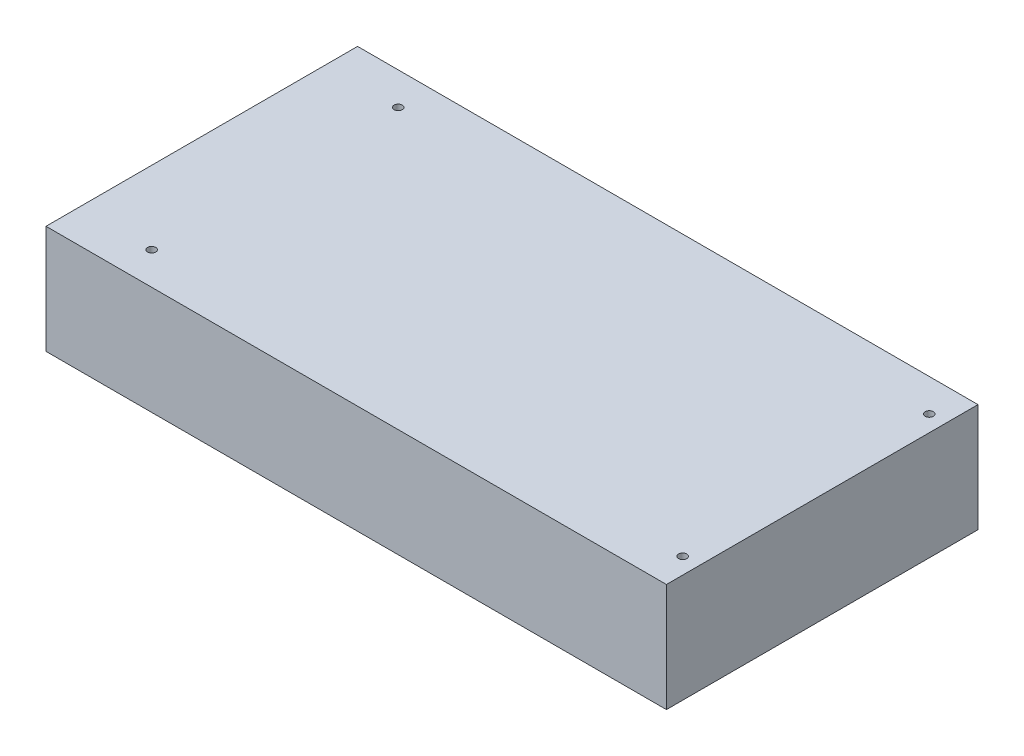
ISO-10303-21;
HEADER;
FILE_DESCRIPTION(('STEP AP214'),'2;1');
FILE_NAME('part.step','',(''),(''),'','','');
FILE_SCHEMA(('AUTOMOTIVE_DESIGN { 1 0 10303 214 1 1 1 1 }'));
ENDSEC;
DATA;
#1=APPLICATION_CONTEXT('core data for automotive mechanical design processes');
#2=APPLICATION_PROTOCOL_DEFINITION('international standard','automotive_design',2000,#1);
#3=PRODUCT_CONTEXT('',#1,'mechanical');
#4=PRODUCT('Part','Part','',(#3));
#5=PRODUCT_RELATED_PRODUCT_CATEGORY('part','',(#4));
#6=PRODUCT_DEFINITION_FORMATION('','',#4);
#7=PRODUCT_DEFINITION_CONTEXT('part definition',#1,'design');
#8=PRODUCT_DEFINITION('design','',#6,#7);
#9=PRODUCT_DEFINITION_SHAPE('','',#8);
#10=(LENGTH_UNIT() NAMED_UNIT(*) SI_UNIT(.MILLI.,.METRE.));
#11=(NAMED_UNIT(*) PLANE_ANGLE_UNIT() SI_UNIT($,.RADIAN.));
#12=(NAMED_UNIT(*) SI_UNIT($,.STERADIAN.) SOLID_ANGLE_UNIT());
#13=UNCERTAINTY_MEASURE_WITH_UNIT(LENGTH_MEASURE(1.E-05),#10,'distance_accuracy_value','');
#14=(GEOMETRIC_REPRESENTATION_CONTEXT(3) GLOBAL_UNCERTAINTY_ASSIGNED_CONTEXT((#13)) GLOBAL_UNIT_ASSIGNED_CONTEXT((#10,
#11,#12)) REPRESENTATION_CONTEXT('',''));
#15=CARTESIAN_POINT('',(0.,0.,0.));
#16=DIRECTION('',(0.,0.,1.));
#17=DIRECTION('',(1.,0.,0.));
#18=AXIS2_PLACEMENT_3D('',#15,#16,#17);
#19=CARTESIAN_POINT('',(227.789756229659,40.,0.));
#20=DIRECTION('',(1.,0.,0.));
#21=DIRECTION('',(0.,0.,-1.));
#22=AXIS2_PLACEMENT_3D('',#19,#20,#21);
#23=PLANE('',#22);
#24=DIRECTION('',(0.,0.,1.));
#25=VECTOR('',#24,1.);
#26=CARTESIAN_POINT('',(227.789756229659,0.,0.));
#27=LINE('',#26,#25);
#28=CARTESIAN_POINT('',(227.789756229659,0.,-35.3016412504768));
#29=VERTEX_POINT('',#28);
#30=CARTESIAN_POINT('',(227.789756229659,0.,79.6983587495232));
#31=VERTEX_POINT('',#30);
#32=EDGE_CURVE('E131',#29,#31,#27,.T.);
#33=ORIENTED_EDGE('',*,*,#32,.F.);
#34=DIRECTION('',(0.,-1.,0.));
#35=VECTOR('',#34,1.);
#36=CARTESIAN_POINT('',(227.789756229659,40.,-35.3016412504768));
#37=LINE('',#36,#35);
#38=CARTESIAN_POINT('',(227.789756229659,40.,-35.3016412504768));
#39=VERTEX_POINT('',#38);
#40=EDGE_CURVE('E11',#39,#29,#37,.T.);
#41=ORIENTED_EDGE('',*,*,#40,.F.);
#42=DIRECTION('',(0.,0.,1.));
#43=VECTOR('',#42,1.);
#44=CARTESIAN_POINT('',(227.789756229659,40.,0.));
#45=LINE('',#44,#43);
#46=CARTESIAN_POINT('',(227.789756229659,40.,79.6983587495232));
#47=VERTEX_POINT('',#46);
#48=EDGE_CURVE('E105',#39,#47,#45,.T.);
#49=ORIENTED_EDGE('',*,*,#48,.T.);
#50=DIRECTION('',(0.,-1.,0.));
#51=VECTOR('',#50,1.);
#52=CARTESIAN_POINT('',(227.789756229659,40.,79.6983587495232));
#53=LINE('',#52,#51);
#54=EDGE_CURVE('E82',#47,#31,#53,.T.);
#55=ORIENTED_EDGE('',*,*,#54,.T.);
#56=EDGE_LOOP('',(#33,#41,#49,#55));
#57=FACE_BOUND('',#56,.T.);
#58=ADVANCED_FACE('F41',(#57),#23,.T.);
#59=CARTESIAN_POINT('',(0.,40.,-35.3016412504768));
#60=DIRECTION('',(0.,0.,-1.));
#61=DIRECTION('',(-1.,0.,0.));
#62=AXIS2_PLACEMENT_3D('',#59,#60,#61);
#63=PLANE('',#62);
#64=DIRECTION('',(1.,0.,0.));
#65=VECTOR('',#64,1.);
#66=CARTESIAN_POINT('',(0.,0.,-35.3016412504768));
#67=LINE('',#66,#65);
#68=CARTESIAN_POINT('',(-1.21024377034129,0.,-35.3016412504768));
#69=VERTEX_POINT('',#68);
#70=EDGE_CURVE('E94',#69,#29,#67,.T.);
#71=ORIENTED_EDGE('',*,*,#70,.F.);
#72=DIRECTION('',(0.,-1.,0.));
#73=VECTOR('',#72,1.);
#74=CARTESIAN_POINT('',(-1.21024377034129,40.,-35.3016412504768));
#75=LINE('',#74,#73);
#76=CARTESIAN_POINT('',(-1.21024377034129,40.,-35.3016412504768));
#77=VERTEX_POINT('',#76);
#78=EDGE_CURVE('E51',#77,#69,#75,.T.);
#79=ORIENTED_EDGE('',*,*,#78,.F.);
#80=DIRECTION('',(1.,0.,0.));
#81=VECTOR('',#80,1.);
#82=CARTESIAN_POINT('',(0.,40.,-35.3016412504768));
#83=LINE('',#82,#81);
#84=EDGE_CURVE('E92',#77,#39,#83,.T.);
#85=ORIENTED_EDGE('',*,*,#84,.T.);
#86=ORIENTED_EDGE('',*,*,#40,.T.);
#87=EDGE_LOOP('',(#71,#79,#85,#86));
#88=FACE_BOUND('',#87,.T.);
#89=ADVANCED_FACE('F90',(#88),#63,.T.);
#90=CARTESIAN_POINT('',(-1.21024377034129,40.,0.));
#91=DIRECTION('',(1.,0.,0.));
#92=DIRECTION('',(0.,0.,-1.));
#93=AXIS2_PLACEMENT_3D('',#90,#91,#92);
#94=PLANE('',#93);
#95=DIRECTION('',(0.,0.,1.));
#96=VECTOR('',#95,1.);
#97=CARTESIAN_POINT('',(-1.21024377034129,0.,0.));
#98=LINE('',#97,#96);
#99=CARTESIAN_POINT('',(-1.21024377034129,0.,79.6983587495232));
#100=VERTEX_POINT('',#99);
#101=EDGE_CURVE('E136',#69,#100,#98,.T.);
#102=ORIENTED_EDGE('',*,*,#101,.T.);
#103=DIRECTION('',(0.,-1.,0.));
#104=VECTOR('',#103,1.);
#105=CARTESIAN_POINT('',(-1.21024377034129,40.,79.6983587495232));
#106=LINE('',#105,#104);
#107=CARTESIAN_POINT('',(-1.21024377034129,40.,79.6983587495232));
#108=VERTEX_POINT('',#107);
#109=EDGE_CURVE('E98',#108,#100,#106,.T.);
#110=ORIENTED_EDGE('',*,*,#109,.F.);
#111=DIRECTION('',(0.,0.,1.));
#112=VECTOR('',#111,1.);
#113=CARTESIAN_POINT('',(-1.21024377034129,40.,0.));
#114=LINE('',#113,#112);
#115=EDGE_CURVE('E100',#77,#108,#114,.T.);
#116=ORIENTED_EDGE('',*,*,#115,.F.);
#117=ORIENTED_EDGE('',*,*,#78,.T.);
#118=EDGE_LOOP('',(#102,#110,#116,#117));
#119=FACE_BOUND('',#118,.T.);
#120=ADVANCED_FACE('F101',(#119),#94,.F.);
#121=CARTESIAN_POINT('',(25.7897562296587,40.,-23.3016412504768));
#122=DIRECTION('',(0.,-1.,0.));
#123=DIRECTION('',(0.,0.,-1.));
#124=AXIS2_PLACEMENT_3D('',#121,#122,#123);
#125=CYLINDRICAL_SURFACE('',#124,1.50000000036683);
#126=CARTESIAN_POINT('',(25.7897562296587,40.,-23.3016412504768));
#127=DIRECTION('',(0.,1.,0.));
#128=DIRECTION('',(0.,0.,1.));
#129=AXIS2_PLACEMENT_3D('',#126,#127,#128);
#130=CIRCLE('',#129,1.50000000036683);
#131=CARTESIAN_POINT('',(25.7897562296587,40.,-21.80164125011));
#132=VERTEX_POINT('',#131);
#133=EDGE_CURVE('E109',#132,#132,#130,.T.);
#134=ORIENTED_EDGE('',*,*,#133,.T.);
#135=EDGE_LOOP('',(#134));
#136=FACE_BOUND('',#135,.T.);
#137=CARTESIAN_POINT('',(25.7897562296587,0.,-23.3016412504768));
#138=DIRECTION('',(0.,1.,0.));
#139=DIRECTION('',(0.,0.,1.));
#140=AXIS2_PLACEMENT_3D('',#137,#138,#139);
#141=CIRCLE('',#140,1.50000000036683);
#142=CARTESIAN_POINT('',(25.7897562296587,0.,-21.80164125011));
#143=VERTEX_POINT('',#142);
#144=EDGE_CURVE('E127',#143,#143,#141,.T.);
#145=ORIENTED_EDGE('',*,*,#144,.F.);
#146=EDGE_LOOP('',(#145));
#147=FACE_BOUND('',#146,.T.);
#148=ADVANCED_FACE('F156',(#136,#147),#125,.F.);
#149=CARTESIAN_POINT('',(25.7897562296587,40.,67.6983587495232));
#150=DIRECTION('',(0.,-1.,0.));
#151=DIRECTION('',(0.,0.,-1.));
#152=AXIS2_PLACEMENT_3D('',#149,#150,#151);
#153=CYLINDRICAL_SURFACE('',#152,1.50000000036683);
#154=CARTESIAN_POINT('',(25.7897562296587,40.,67.6983587495232));
#155=DIRECTION('',(0.,1.,0.));
#156=DIRECTION('',(0.,0.,1.));
#157=AXIS2_PLACEMENT_3D('',#154,#155,#156);
#158=CIRCLE('',#157,1.50000000036683);
#159=CARTESIAN_POINT('',(25.7897562296587,40.,69.19835874989));
#160=VERTEX_POINT('',#159);
#161=EDGE_CURVE('E256',#160,#160,#158,.T.);
#162=ORIENTED_EDGE('',*,*,#161,.T.);
#163=EDGE_LOOP('',(#162));
#164=FACE_BOUND('',#163,.T.);
#165=CARTESIAN_POINT('',(25.7897562296587,0.,67.6983587495232));
#166=DIRECTION('',(0.,1.,0.));
#167=DIRECTION('',(0.,0.,1.));
#168=AXIS2_PLACEMENT_3D('',#165,#166,#167);
#169=CIRCLE('',#168,1.50000000036683);
#170=CARTESIAN_POINT('',(25.7897562296587,0.,69.19835874989));
#171=VERTEX_POINT('',#170);
#172=EDGE_CURVE('E123',#171,#171,#169,.T.);
#173=ORIENTED_EDGE('',*,*,#172,.F.);
#174=EDGE_LOOP('',(#173));
#175=FACE_BOUND('',#174,.T.);
#176=ADVANCED_FACE('F159',(#164,#175),#153,.F.);
#177=CARTESIAN_POINT('',(221.789756229659,40.,-23.3016412504768));
#178=DIRECTION('',(0.,-1.,0.));
#179=DIRECTION('',(0.,0.,-1.));
#180=AXIS2_PLACEMENT_3D('',#177,#178,#179);
#181=CYLINDRICAL_SURFACE('',#180,1.50000000036683);
#182=CARTESIAN_POINT('',(221.789756229659,40.,-23.3016412504768));
#183=DIRECTION('',(0.,1.,0.));
#184=DIRECTION('',(0.,0.,1.));
#185=AXIS2_PLACEMENT_3D('',#182,#183,#184);
#186=CIRCLE('',#185,1.50000000036683);
#187=CARTESIAN_POINT('',(221.789756229659,40.,-21.80164125011));
#188=VERTEX_POINT('',#187);
#189=EDGE_CURVE('E173',#188,#188,#186,.T.);
#190=ORIENTED_EDGE('',*,*,#189,.T.);
#191=EDGE_LOOP('',(#190));
#192=FACE_BOUND('',#191,.T.);
#193=CARTESIAN_POINT('',(221.789756229659,0.,-23.3016412504768));
#194=DIRECTION('',(0.,1.,0.));
#195=DIRECTION('',(0.,0.,1.));
#196=AXIS2_PLACEMENT_3D('',#193,#194,#195);
#197=CIRCLE('',#196,1.50000000036683);
#198=CARTESIAN_POINT('',(221.789756229659,0.,-21.80164125011));
#199=VERTEX_POINT('',#198);
#200=EDGE_CURVE('E119',#199,#199,#197,.T.);
#201=ORIENTED_EDGE('',*,*,#200,.F.);
#202=EDGE_LOOP('',(#201));
#203=FACE_BOUND('',#202,.T.);
#204=ADVANCED_FACE('F162',(#192,#203),#181,.F.);
#205=CARTESIAN_POINT('',(221.789756229659,40.,67.6983587495232));
#206=DIRECTION('',(0.,-1.,0.));
#207=DIRECTION('',(0.,0.,-1.));
#208=AXIS2_PLACEMENT_3D('',#205,#206,#207);
#209=CYLINDRICAL_SURFACE('',#208,1.50000000036683);
#210=CARTESIAN_POINT('',(221.789756229659,40.,67.6983587495232));
#211=DIRECTION('',(0.,1.,0.));
#212=DIRECTION('',(0.,0.,1.));
#213=AXIS2_PLACEMENT_3D('',#210,#211,#212);
#214=CIRCLE('',#213,1.50000000036683);
#215=CARTESIAN_POINT('',(221.789756229659,40.,69.19835874989));
#216=VERTEX_POINT('',#215);
#217=EDGE_CURVE('E141',#216,#216,#214,.T.);
#218=ORIENTED_EDGE('',*,*,#217,.T.);
#219=EDGE_LOOP('',(#218));
#220=FACE_BOUND('',#219,.T.);
#221=CARTESIAN_POINT('',(221.789756229659,0.,67.6983587495232));
#222=DIRECTION('',(0.,1.,0.));
#223=DIRECTION('',(0.,0.,1.));
#224=AXIS2_PLACEMENT_3D('',#221,#222,#223);
#225=CIRCLE('',#224,1.50000000036683);
#226=CARTESIAN_POINT('',(221.789756229659,0.,69.19835874989));
#227=VERTEX_POINT('',#226);
#228=EDGE_CURVE('E115',#227,#227,#225,.T.);
#229=ORIENTED_EDGE('',*,*,#228,.F.);
#230=EDGE_LOOP('',(#229));
#231=FACE_BOUND('',#230,.T.);
#232=ADVANCED_FACE('F43',(#220,#231),#209,.F.);
#233=CARTESIAN_POINT('',(0.,40.,79.6983587495232));
#234=DIRECTION('',(0.,0.,-1.));
#235=DIRECTION('',(-1.,0.,0.));
#236=AXIS2_PLACEMENT_3D('',#233,#234,#235);
#237=PLANE('',#236);
#238=DIRECTION('',(1.,0.,0.));
#239=VECTOR('',#238,1.);
#240=CARTESIAN_POINT('',(0.,0.,79.6983587495232));
#241=LINE('',#240,#239);
#242=EDGE_CURVE('E75',#100,#31,#241,.T.);
#243=ORIENTED_EDGE('',*,*,#242,.T.);
#244=ORIENTED_EDGE('',*,*,#54,.F.);
#245=DIRECTION('',(1.,0.,0.));
#246=VECTOR('',#245,1.);
#247=CARTESIAN_POINT('',(0.,40.,79.6983587495232));
#248=LINE('',#247,#246);
#249=EDGE_CURVE('E59',#108,#47,#248,.T.);
#250=ORIENTED_EDGE('',*,*,#249,.F.);
#251=ORIENTED_EDGE('',*,*,#109,.T.);
#252=EDGE_LOOP('',(#243,#244,#250,#251));
#253=FACE_BOUND('',#252,.T.);
#254=ADVANCED_FACE('F146',(#253),#237,.F.);
#255=CARTESIAN_POINT('',(0.,40.,0.));
#256=DIRECTION('',(0.,1.,0.));
#257=DIRECTION('',(0.,0.,1.));
#258=AXIS2_PLACEMENT_3D('',#255,#256,#257);
#259=PLANE('',#258);
#260=ORIENTED_EDGE('',*,*,#217,.F.);
#261=EDGE_LOOP('',(#260));
#262=FACE_BOUND('',#261,.T.);
#263=ORIENTED_EDGE('',*,*,#189,.F.);
#264=EDGE_LOOP('',(#263));
#265=FACE_BOUND('',#264,.T.);
#266=ORIENTED_EDGE('',*,*,#161,.F.);
#267=EDGE_LOOP('',(#266));
#268=FACE_BOUND('',#267,.T.);
#269=ORIENTED_EDGE('',*,*,#133,.F.);
#270=EDGE_LOOP('',(#269));
#271=FACE_BOUND('',#270,.T.);
#272=ORIENTED_EDGE('',*,*,#48,.F.);
#273=ORIENTED_EDGE('',*,*,#84,.F.);
#274=ORIENTED_EDGE('',*,*,#115,.T.);
#275=ORIENTED_EDGE('',*,*,#249,.T.);
#276=EDGE_LOOP('',(#272,#273,#274,#275));
#277=FACE_BOUND('',#276,.T.);
#278=ADVANCED_FACE('F104',(#262,#265,#268,#271,#277),#259,.T.);
#279=CARTESIAN_POINT('',(0.,0.,0.));
#280=DIRECTION('',(0.,1.,0.));
#281=DIRECTION('',(0.,0.,1.));
#282=AXIS2_PLACEMENT_3D('',#279,#280,#281);
#283=PLANE('',#282);
#284=ORIENTED_EDGE('',*,*,#228,.T.);
#285=EDGE_LOOP('',(#284));
#286=FACE_BOUND('',#285,.T.);
#287=ORIENTED_EDGE('',*,*,#200,.T.);
#288=EDGE_LOOP('',(#287));
#289=FACE_BOUND('',#288,.T.);
#290=ORIENTED_EDGE('',*,*,#172,.T.);
#291=EDGE_LOOP('',(#290));
#292=FACE_BOUND('',#291,.T.);
#293=ORIENTED_EDGE('',*,*,#144,.T.);
#294=EDGE_LOOP('',(#293));
#295=FACE_BOUND('',#294,.T.);
#296=ORIENTED_EDGE('',*,*,#32,.T.);
#297=ORIENTED_EDGE('',*,*,#242,.F.);
#298=ORIENTED_EDGE('',*,*,#101,.F.);
#299=ORIENTED_EDGE('',*,*,#70,.T.);
#300=EDGE_LOOP('',(#296,#297,#298,#299));
#301=FACE_BOUND('',#300,.T.);
#302=ADVANCED_FACE('F147',(#286,#289,#292,#295,#301),#283,.F.);
#303=CLOSED_SHELL('',(#58,#89,#120,#148,#176,#204,#232,#254,#278,#302));
#304=MANIFOLD_SOLID_BREP('B2',#303);
#305=ADVANCED_BREP_SHAPE_REPRESENTATION('',(#18,#304),#14);
#306=SHAPE_DEFINITION_REPRESENTATION(#9,#305);
ENDSEC;
END-ISO-10303-21;
